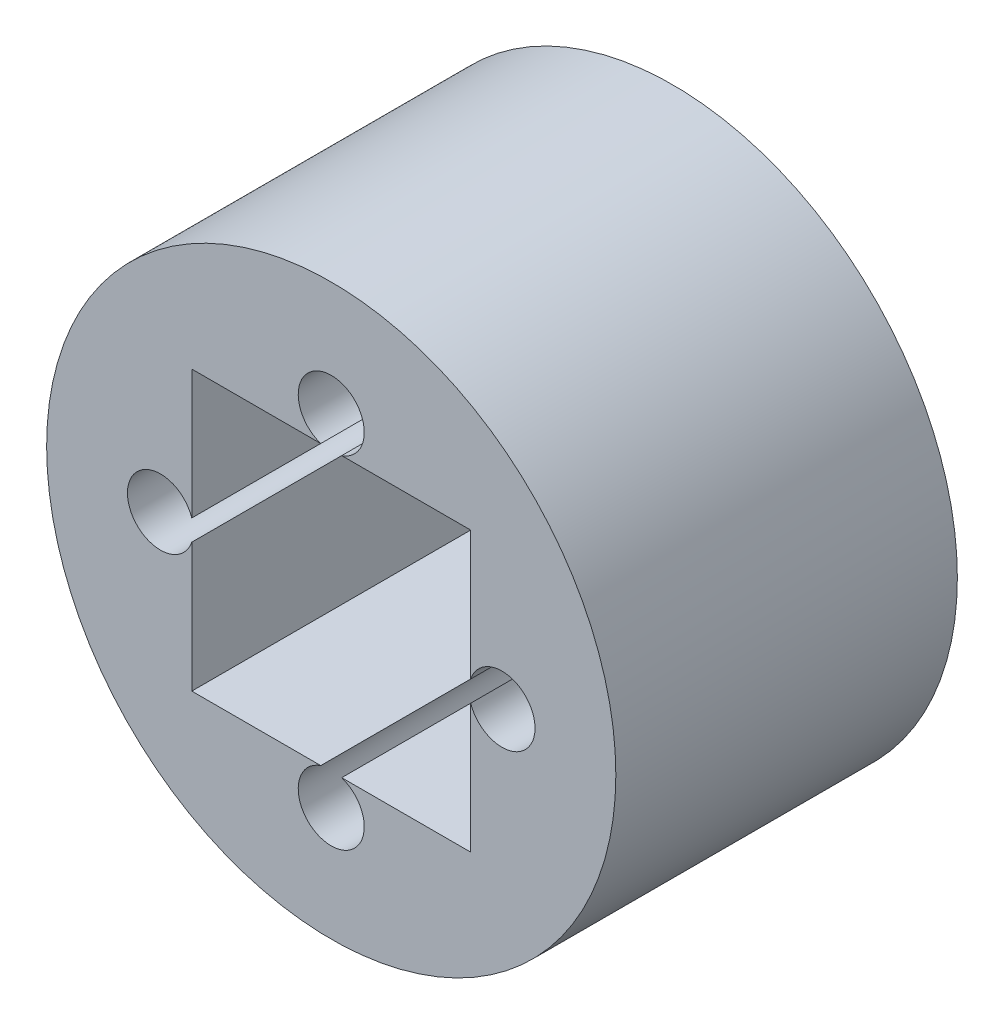
ISO-10303-21;
HEADER;
FILE_DESCRIPTION(('STEP AP214'),'2;1');
FILE_NAME('part.step','',(''),(''),'','','');
FILE_SCHEMA(('AUTOMOTIVE_DESIGN { 1 0 10303 214 1 1 1 1 }'));
ENDSEC;
DATA;
#1=APPLICATION_CONTEXT('core data for automotive mechanical design processes');
#2=APPLICATION_PROTOCOL_DEFINITION('international standard','automotive_design',2000,#1);
#3=PRODUCT_CONTEXT('',#1,'mechanical');
#4=PRODUCT('Part','Part','',(#3));
#5=PRODUCT_RELATED_PRODUCT_CATEGORY('part','',(#4));
#6=PRODUCT_DEFINITION_FORMATION('','',#4);
#7=PRODUCT_DEFINITION_CONTEXT('part definition',#1,'design');
#8=PRODUCT_DEFINITION('design','',#6,#7);
#9=PRODUCT_DEFINITION_SHAPE('','',#8);
#10=(LENGTH_UNIT() NAMED_UNIT(*) SI_UNIT(.MILLI.,.METRE.));
#11=(NAMED_UNIT(*) PLANE_ANGLE_UNIT() SI_UNIT($,.RADIAN.));
#12=(NAMED_UNIT(*) SI_UNIT($,.STERADIAN.) SOLID_ANGLE_UNIT());
#13=UNCERTAINTY_MEASURE_WITH_UNIT(LENGTH_MEASURE(1.E-05),#10,'distance_accuracy_value','');
#14=(GEOMETRIC_REPRESENTATION_CONTEXT(3) GLOBAL_UNCERTAINTY_ASSIGNED_CONTEXT((#13)) GLOBAL_UNIT_ASSIGNED_CONTEXT((#10,
#11,#12)) REPRESENTATION_CONTEXT('',''));
#15=CARTESIAN_POINT('',(0.,0.,0.));
#16=DIRECTION('',(0.,0.,1.));
#17=DIRECTION('',(1.,0.,0.));
#18=AXIS2_PLACEMENT_3D('',#15,#16,#17);
#19=CARTESIAN_POINT('',(6.125,6.125,-7.501));
#20=DIRECTION('',(1.,0.,0.));
#21=DIRECTION('',(0.,1.,0.));
#22=AXIS2_PLACEMENT_3D('',#19,#20,#21);
#23=PLANE('',#22);
#24=DIRECTION('',(0.,-1.,0.));
#25=VECTOR('',#24,1.);
#26=CARTESIAN_POINT('',(6.125,6.125,-7.5));
#27=LINE('',#26,#25);
#28=CARTESIAN_POINT('',(6.125,6.125,-7.5));
#29=VERTEX_POINT('',#28);
#30=CARTESIAN_POINT('',(6.125,0.460298815988065,-7.5));
#31=VERTEX_POINT('',#30);
#32=EDGE_CURVE('E144',#29,#31,#27,.T.);
#33=ORIENTED_EDGE('',*,*,#32,.T.);
#34=DIRECTION('',(0.,0.,1.));
#35=VECTOR('',#34,1.);
#36=CARTESIAN_POINT('',(6.125,0.460298815988067,-7.501));
#37=LINE('',#36,#35);
#38=CARTESIAN_POINT('',(6.125,0.460298815988067,7.5));
#39=VERTEX_POINT('',#38);
#40=EDGE_CURVE('E130',#39,#31,#37,.F.);
#41=ORIENTED_EDGE('',*,*,#40,.F.);
#42=DIRECTION('',(0.,1.,0.));
#43=VECTOR('',#42,1.);
#44=CARTESIAN_POINT('',(6.125,6.125,7.5));
#45=LINE('',#44,#43);
#46=CARTESIAN_POINT('',(6.125,6.125,7.5));
#47=VERTEX_POINT('',#46);
#48=EDGE_CURVE('E141',#39,#47,#45,.T.);
#49=ORIENTED_EDGE('',*,*,#48,.T.);
#50=DIRECTION('',(0.,0.,1.));
#51=VECTOR('',#50,1.);
#52=CARTESIAN_POINT('',(6.125,6.125,-7.501));
#53=LINE('',#52,#51);
#54=EDGE_CURVE('E175',#29,#47,#53,.T.);
#55=ORIENTED_EDGE('',*,*,#54,.F.);
#56=EDGE_LOOP('',(#33,#41,#49,#55));
#57=FACE_BOUND('',#56,.T.);
#58=ADVANCED_FACE('F39',(#57),#23,.F.);
#59=CARTESIAN_POINT('',(-6.125,-6.125,-7.501));
#60=DIRECTION('',(0.,-1.,0.));
#61=DIRECTION('',(0.,0.,-1.));
#62=AXIS2_PLACEMENT_3D('',#59,#60,#61);
#63=PLANE('',#62);
#64=DIRECTION('',(-1.,0.,0.));
#65=VECTOR('',#64,1.);
#66=CARTESIAN_POINT('',(-6.125,-6.125,-7.5));
#67=LINE('',#66,#65);
#68=CARTESIAN_POINT('',(6.125,-6.125,-7.5));
#69=VERTEX_POINT('',#68);
#70=CARTESIAN_POINT('',(0.460298815987988,-6.125,-7.5));
#71=VERTEX_POINT('',#70);
#72=EDGE_CURVE('E255',#69,#71,#67,.T.);
#73=ORIENTED_EDGE('',*,*,#72,.T.);
#74=DIRECTION('',(0.,0.,1.));
#75=VECTOR('',#74,1.);
#76=CARTESIAN_POINT('',(0.460298815987988,-6.125,-7.501));
#77=LINE('',#76,#75);
#78=CARTESIAN_POINT('',(0.460298815987989,-6.125,7.5));
#79=VERTEX_POINT('',#78);
#80=EDGE_CURVE('E222',#79,#71,#77,.F.);
#81=ORIENTED_EDGE('',*,*,#80,.F.);
#82=DIRECTION('',(1.,0.,0.));
#83=VECTOR('',#82,1.);
#84=CARTESIAN_POINT('',(-6.125,-6.125,7.5));
#85=LINE('',#84,#83);
#86=CARTESIAN_POINT('',(6.125,-6.125,7.5));
#87=VERTEX_POINT('',#86);
#88=EDGE_CURVE('E170',#79,#87,#85,.T.);
#89=ORIENTED_EDGE('',*,*,#88,.T.);
#90=DIRECTION('',(0.,0.,1.));
#91=VECTOR('',#90,1.);
#92=CARTESIAN_POINT('',(6.125,-6.125,-7.501));
#93=LINE('',#92,#91);
#94=EDGE_CURVE('E176',#69,#87,#93,.T.);
#95=ORIENTED_EDGE('',*,*,#94,.F.);
#96=EDGE_LOOP('',(#73,#81,#89,#95));
#97=FACE_BOUND('',#96,.T.);
#98=ADVANCED_FACE('F301',(#97),#63,.F.);
#99=CARTESIAN_POINT('',(-6.125,6.125,-7.501));
#100=DIRECTION('',(-1.,0.,0.));
#101=DIRECTION('',(0.,-1.,0.));
#102=AXIS2_PLACEMENT_3D('',#99,#100,#101);
#103=PLANE('',#102);
#104=DIRECTION('',(0.,1.,0.));
#105=VECTOR('',#104,1.);
#106=CARTESIAN_POINT('',(-6.125,6.125,-7.5));
#107=LINE('',#106,#105);
#108=CARTESIAN_POINT('',(-6.125,-6.125,-7.5));
#109=VERTEX_POINT('',#108);
#110=CARTESIAN_POINT('',(-6.125,-0.460298815988067,-7.5));
#111=VERTEX_POINT('',#110);
#112=EDGE_CURVE('E216',#109,#111,#107,.T.);
#113=ORIENTED_EDGE('',*,*,#112,.T.);
#114=DIRECTION('',(0.,0.,1.));
#115=VECTOR('',#114,1.);
#116=CARTESIAN_POINT('',(-6.125,-0.460298815988067,-7.501));
#117=LINE('',#116,#115);
#118=CARTESIAN_POINT('',(-6.125,-0.460298815988068,7.5));
#119=VERTEX_POINT('',#118);
#120=EDGE_CURVE('E234',#119,#111,#117,.F.);
#121=ORIENTED_EDGE('',*,*,#120,.F.);
#122=DIRECTION('',(0.,-1.,0.));
#123=VECTOR('',#122,1.);
#124=CARTESIAN_POINT('',(-6.125,6.125,7.5));
#125=LINE('',#124,#123);
#126=CARTESIAN_POINT('',(-6.125,-6.125,7.5));
#127=VERTEX_POINT('',#126);
#128=EDGE_CURVE('E165',#119,#127,#125,.T.);
#129=ORIENTED_EDGE('',*,*,#128,.T.);
#130=DIRECTION('',(0.,0.,1.));
#131=VECTOR('',#130,1.);
#132=CARTESIAN_POINT('',(-6.125,-6.125,-7.501));
#133=LINE('',#132,#131);
#134=EDGE_CURVE('E181',#109,#127,#133,.T.);
#135=ORIENTED_EDGE('',*,*,#134,.F.);
#136=EDGE_LOOP('',(#113,#121,#129,#135));
#137=FACE_BOUND('',#136,.T.);
#138=ADVANCED_FACE('F270',(#137),#103,.F.);
#139=CARTESIAN_POINT('',(-6.125,6.125,-7.501));
#140=DIRECTION('',(0.,1.,0.));
#141=DIRECTION('',(0.,0.,1.));
#142=AXIS2_PLACEMENT_3D('',#139,#140,#141);
#143=PLANE('',#142);
#144=DIRECTION('',(1.,0.,0.));
#145=VECTOR('',#144,1.);
#146=CARTESIAN_POINT('',(-6.125,6.125,-7.5));
#147=LINE('',#146,#145);
#148=CARTESIAN_POINT('',(-6.125,6.125,-7.5));
#149=VERTEX_POINT('',#148);
#150=CARTESIAN_POINT('',(-0.460298815988069,6.125,-7.5));
#151=VERTEX_POINT('',#150);
#152=EDGE_CURVE('E191',#149,#151,#147,.T.);
#153=ORIENTED_EDGE('',*,*,#152,.T.);
#154=DIRECTION('',(0.,0.,1.));
#155=VECTOR('',#154,1.);
#156=CARTESIAN_POINT('',(-0.460298815988069,6.125,-7.501));
#157=LINE('',#156,#155);
#158=CARTESIAN_POINT('',(-0.460298815988069,6.125,7.5));
#159=VERTEX_POINT('',#158);
#160=EDGE_CURVE('E245',#159,#151,#157,.F.);
#161=ORIENTED_EDGE('',*,*,#160,.F.);
#162=DIRECTION('',(-1.,0.,0.));
#163=VECTOR('',#162,1.);
#164=CARTESIAN_POINT('',(-6.125,6.125,7.5));
#165=LINE('',#164,#163);
#166=CARTESIAN_POINT('',(-6.125,6.125,7.5));
#167=VERTEX_POINT('',#166);
#168=EDGE_CURVE('E158',#159,#167,#165,.T.);
#169=ORIENTED_EDGE('',*,*,#168,.T.);
#170=DIRECTION('',(0.,0.,1.));
#171=VECTOR('',#170,1.);
#172=CARTESIAN_POINT('',(-6.125,6.125,-7.501));
#173=LINE('',#172,#171);
#174=EDGE_CURVE('E185',#149,#167,#173,.T.);
#175=ORIENTED_EDGE('',*,*,#174,.F.);
#176=EDGE_LOOP('',(#153,#161,#169,#175));
#177=FACE_BOUND('',#176,.T.);
#178=ADVANCED_FACE('F287',(#177),#143,.F.);
#179=CARTESIAN_POINT('',(0.,0.,7.5));
#180=DIRECTION('',(0.,0.,-1.));
#181=DIRECTION('',(-1.,0.,0.));
#182=AXIS2_PLACEMENT_3D('',#179,#180,#181);
#183=CYLINDRICAL_SURFACE('',#182,12.5);
#184=CARTESIAN_POINT('',(0.,0.,7.5));
#185=DIRECTION('',(0.,0.,1.));
#186=DIRECTION('',(1.,0.,0.));
#187=AXIS2_PLACEMENT_3D('',#184,#185,#186);
#188=CIRCLE('',#187,12.5);
#189=CARTESIAN_POINT('',(12.5,0.,7.5));
#190=VERTEX_POINT('',#189);
#191=EDGE_CURVE('E11',#190,#190,#188,.T.);
#192=ORIENTED_EDGE('',*,*,#191,.F.);
#193=EDGE_LOOP('',(#192));
#194=FACE_BOUND('',#193,.T.);
#195=CARTESIAN_POINT('',(0.,0.,-7.5));
#196=DIRECTION('',(0.,0.,1.));
#197=DIRECTION('',(1.,0.,0.));
#198=AXIS2_PLACEMENT_3D('',#195,#196,#197);
#199=CIRCLE('',#198,12.5);
#200=CARTESIAN_POINT('',(12.5,0.,-7.5));
#201=VERTEX_POINT('',#200);
#202=EDGE_CURVE('E43',#201,#201,#199,.T.);
#203=ORIENTED_EDGE('',*,*,#202,.T.);
#204=EDGE_LOOP('',(#203));
#205=FACE_BOUND('',#204,.T.);
#206=ADVANCED_FACE('F41',(#194,#205),#183,.T.);
#207=CARTESIAN_POINT('',(0.,0.,7.5));
#208=DIRECTION('',(0.,0.,1.));
#209=DIRECTION('',(1.,0.,0.));
#210=AXIS2_PLACEMENT_3D('',#207,#208,#209);
#211=PLANE('',#210);
#212=CARTESIAN_POINT('',(7.5,0.,7.5));
#213=DIRECTION('',(0.,0.,1.));
#214=DIRECTION('',(1.,0.,0.));
#215=AXIS2_PLACEMENT_3D('',#212,#213,#214);
#216=CIRCLE('',#215,1.45);
#217=CARTESIAN_POINT('',(6.125,-0.460298815988014,7.5));
#218=VERTEX_POINT('',#217);
#219=EDGE_CURVE('E127',#218,#39,#216,.T.);
#220=ORIENTED_EDGE('',*,*,#219,.F.);
#221=EDGE_CURVE('E154',#87,#218,#45,.T.);
#222=ORIENTED_EDGE('',*,*,#221,.F.);
#223=ORIENTED_EDGE('',*,*,#88,.F.);
#224=CARTESIAN_POINT('',(0.,-7.50000000000004,7.5));
#225=DIRECTION('',(0.,0.,1.));
#226=DIRECTION('',(1.,0.,0.));
#227=AXIS2_PLACEMENT_3D('',#224,#225,#226);
#228=CIRCLE('',#227,1.45);
#229=CARTESIAN_POINT('',(-0.460298815987865,-6.125,7.5));
#230=VERTEX_POINT('',#229);
#231=EDGE_CURVE('E226',#230,#79,#228,.T.);
#232=ORIENTED_EDGE('',*,*,#231,.F.);
#233=EDGE_CURVE('E171',#127,#230,#85,.T.);
#234=ORIENTED_EDGE('',*,*,#233,.F.);
#235=ORIENTED_EDGE('',*,*,#128,.F.);
#236=CARTESIAN_POINT('',(-7.5,0.,7.5));
#237=DIRECTION('',(0.,0.,1.));
#238=DIRECTION('',(1.,0.,0.));
#239=AXIS2_PLACEMENT_3D('',#236,#237,#238);
#240=CIRCLE('',#239,1.45);
#241=CARTESIAN_POINT('',(-6.125,0.460298815988013,7.5));
#242=VERTEX_POINT('',#241);
#243=EDGE_CURVE('E238',#242,#119,#240,.T.);
#244=ORIENTED_EDGE('',*,*,#243,.F.);
#245=EDGE_CURVE('E166',#167,#242,#125,.T.);
#246=ORIENTED_EDGE('',*,*,#245,.F.);
#247=ORIENTED_EDGE('',*,*,#168,.F.);
#248=CARTESIAN_POINT('',(0.,7.5,7.5));
#249=DIRECTION('',(0.,0.,1.));
#250=DIRECTION('',(1.,0.,0.));
#251=AXIS2_PLACEMENT_3D('',#248,#249,#250);
#252=CIRCLE('',#251,1.45);
#253=CARTESIAN_POINT('',(0.460298815988014,6.125,7.5));
#254=VERTEX_POINT('',#253);
#255=EDGE_CURVE('E248',#254,#159,#252,.T.);
#256=ORIENTED_EDGE('',*,*,#255,.F.);
#257=EDGE_CURVE('E152',#47,#254,#165,.T.);
#258=ORIENTED_EDGE('',*,*,#257,.F.);
#259=ORIENTED_EDGE('',*,*,#48,.F.);
#260=EDGE_LOOP('',(#220,#222,#223,#232,#234,#235,#244,#246,#247,#256,#258,#259));
#261=FACE_BOUND('',#260,.T.);
#262=ORIENTED_EDGE('',*,*,#191,.T.);
#263=EDGE_LOOP('',(#262));
#264=FACE_BOUND('',#263,.T.);
#265=ADVANCED_FACE('F148',(#261,#264),#211,.T.);
#266=CARTESIAN_POINT('',(0.,0.,-7.5));
#267=DIRECTION('',(0.,0.,1.));
#268=DIRECTION('',(1.,0.,0.));
#269=AXIS2_PLACEMENT_3D('',#266,#267,#268);
#270=PLANE('',#269);
#271=CARTESIAN_POINT('',(6.125,-0.460298815988014,-7.5));
#272=VERTEX_POINT('',#271);
#273=EDGE_CURVE('E159',#272,#69,#27,.T.);
#274=ORIENTED_EDGE('',*,*,#273,.F.);
#275=CARTESIAN_POINT('',(7.5,0.,-7.5));
#276=DIRECTION('',(0.,0.,1.));
#277=DIRECTION('',(1.,0.,0.));
#278=AXIS2_PLACEMENT_3D('',#275,#276,#277);
#279=CIRCLE('',#278,1.45);
#280=EDGE_CURVE('E55',#31,#272,#279,.F.);
#281=ORIENTED_EDGE('',*,*,#280,.F.);
#282=ORIENTED_EDGE('',*,*,#32,.F.);
#283=CARTESIAN_POINT('',(0.460298815988014,6.125,-7.5));
#284=VERTEX_POINT('',#283);
#285=EDGE_CURVE('E180',#284,#29,#147,.T.);
#286=ORIENTED_EDGE('',*,*,#285,.F.);
#287=CARTESIAN_POINT('',(0.,7.5,-7.5));
#288=DIRECTION('',(0.,0.,1.));
#289=DIRECTION('',(1.,0.,0.));
#290=AXIS2_PLACEMENT_3D('',#287,#288,#289);
#291=CIRCLE('',#290,1.45);
#292=EDGE_CURVE('E235',#151,#284,#291,.F.);
#293=ORIENTED_EDGE('',*,*,#292,.F.);
#294=ORIENTED_EDGE('',*,*,#152,.F.);
#295=CARTESIAN_POINT('',(-6.125,0.460298815988013,-7.5));
#296=VERTEX_POINT('',#295);
#297=EDGE_CURVE('E213',#296,#149,#107,.T.);
#298=ORIENTED_EDGE('',*,*,#297,.F.);
#299=CARTESIAN_POINT('',(-7.5,0.,-7.5));
#300=DIRECTION('',(0.,0.,1.));
#301=DIRECTION('',(1.,0.,0.));
#302=AXIS2_PLACEMENT_3D('',#299,#300,#301);
#303=CIRCLE('',#302,1.45);
#304=EDGE_CURVE('E223',#111,#296,#303,.F.);
#305=ORIENTED_EDGE('',*,*,#304,.F.);
#306=ORIENTED_EDGE('',*,*,#112,.F.);
#307=CARTESIAN_POINT('',(-0.460298815987865,-6.125,-7.5));
#308=VERTEX_POINT('',#307);
#309=EDGE_CURVE('E254',#308,#109,#67,.T.);
#310=ORIENTED_EDGE('',*,*,#309,.F.);
#311=CARTESIAN_POINT('',(0.,-7.50000000000004,-7.5));
#312=DIRECTION('',(0.,0.,1.));
#313=DIRECTION('',(1.,0.,0.));
#314=AXIS2_PLACEMENT_3D('',#311,#312,#313);
#315=CIRCLE('',#314,1.45);
#316=EDGE_CURVE('E63',#71,#308,#315,.F.);
#317=ORIENTED_EDGE('',*,*,#316,.F.);
#318=ORIENTED_EDGE('',*,*,#72,.F.);
#319=EDGE_LOOP('',(#274,#281,#282,#286,#293,#294,#298,#305,#306,#310,#317,#318));
#320=FACE_BOUND('',#319,.T.);
#321=ORIENTED_EDGE('',*,*,#202,.F.);
#322=EDGE_LOOP('',(#321));
#323=FACE_BOUND('',#322,.T.);
#324=ADVANCED_FACE('F209',(#320,#323),#270,.F.);
#325=ORIENTED_EDGE('',*,*,#221,.T.);
#326=DIRECTION('',(0.,0.,1.));
#327=VECTOR('',#326,1.);
#328=CARTESIAN_POINT('',(6.125,-0.460298815988014,-7.501));
#329=LINE('',#328,#327);
#330=EDGE_CURVE('E131',#272,#218,#329,.T.);
#331=ORIENTED_EDGE('',*,*,#330,.F.);
#332=ORIENTED_EDGE('',*,*,#273,.T.);
#333=ORIENTED_EDGE('',*,*,#94,.T.);
#334=EDGE_LOOP('',(#325,#331,#332,#333));
#335=FACE_BOUND('',#334,.T.);
#336=ADVANCED_FACE('F303',(#335),#23,.F.);
#337=ORIENTED_EDGE('',*,*,#233,.T.);
#338=DIRECTION('',(0.,0.,1.));
#339=VECTOR('',#338,1.);
#340=CARTESIAN_POINT('',(-0.460298815987865,-6.125,-7.501));
#341=LINE('',#340,#339);
#342=EDGE_CURVE('E219',#308,#230,#341,.T.);
#343=ORIENTED_EDGE('',*,*,#342,.F.);
#344=ORIENTED_EDGE('',*,*,#309,.T.);
#345=ORIENTED_EDGE('',*,*,#134,.T.);
#346=EDGE_LOOP('',(#337,#343,#344,#345));
#347=FACE_BOUND('',#346,.T.);
#348=ADVANCED_FACE('F266',(#347),#63,.F.);
#349=ORIENTED_EDGE('',*,*,#245,.T.);
#350=DIRECTION('',(0.,0.,1.));
#351=VECTOR('',#350,1.);
#352=CARTESIAN_POINT('',(-6.125,0.460298815988013,-7.501));
#353=LINE('',#352,#351);
#354=EDGE_CURVE('E231',#296,#242,#353,.T.);
#355=ORIENTED_EDGE('',*,*,#354,.F.);
#356=ORIENTED_EDGE('',*,*,#297,.T.);
#357=ORIENTED_EDGE('',*,*,#174,.T.);
#358=EDGE_LOOP('',(#349,#355,#356,#357));
#359=FACE_BOUND('',#358,.T.);
#360=ADVANCED_FACE('F280',(#359),#103,.F.);
#361=ORIENTED_EDGE('',*,*,#257,.T.);
#362=DIRECTION('',(0.,0.,1.));
#363=VECTOR('',#362,1.);
#364=CARTESIAN_POINT('',(0.460298815988014,6.125,-7.501));
#365=LINE('',#364,#363);
#366=EDGE_CURVE('E205',#284,#254,#365,.T.);
#367=ORIENTED_EDGE('',*,*,#366,.F.);
#368=ORIENTED_EDGE('',*,*,#285,.T.);
#369=ORIENTED_EDGE('',*,*,#54,.T.);
#370=EDGE_LOOP('',(#361,#367,#368,#369));
#371=FACE_BOUND('',#370,.T.);
#372=ADVANCED_FACE('F204',(#371),#143,.F.);
#373=CARTESIAN_POINT('',(0.,7.5,-7.501));
#374=DIRECTION('',(0.,0.,1.));
#375=DIRECTION('',(1.,0.,0.));
#376=AXIS2_PLACEMENT_3D('',#373,#374,#375);
#377=CYLINDRICAL_SURFACE('',#376,1.45);
#378=ORIENTED_EDGE('',*,*,#160,.T.);
#379=ORIENTED_EDGE('',*,*,#292,.T.);
#380=ORIENTED_EDGE('',*,*,#366,.T.);
#381=ORIENTED_EDGE('',*,*,#255,.T.);
#382=EDGE_LOOP('',(#378,#379,#380,#381));
#383=FACE_BOUND('',#382,.T.);
#384=ADVANCED_FACE('F289',(#383),#377,.F.);
#385=CARTESIAN_POINT('',(-7.5,0.,-7.501));
#386=DIRECTION('',(0.,0.,1.));
#387=DIRECTION('',(1.,0.,0.));
#388=AXIS2_PLACEMENT_3D('',#385,#386,#387);
#389=CYLINDRICAL_SURFACE('',#388,1.45);
#390=ORIENTED_EDGE('',*,*,#120,.T.);
#391=ORIENTED_EDGE('',*,*,#304,.T.);
#392=ORIENTED_EDGE('',*,*,#354,.T.);
#393=ORIENTED_EDGE('',*,*,#243,.T.);
#394=EDGE_LOOP('',(#390,#391,#392,#393));
#395=FACE_BOUND('',#394,.T.);
#396=ADVANCED_FACE('F277',(#395),#389,.F.);
#397=CARTESIAN_POINT('',(0.,-7.50000000000004,-7.501));
#398=DIRECTION('',(0.,0.,1.));
#399=DIRECTION('',(1.,0.,0.));
#400=AXIS2_PLACEMENT_3D('',#397,#398,#399);
#401=CYLINDRICAL_SURFACE('',#400,1.45);
#402=ORIENTED_EDGE('',*,*,#80,.T.);
#403=ORIENTED_EDGE('',*,*,#316,.T.);
#404=ORIENTED_EDGE('',*,*,#342,.T.);
#405=ORIENTED_EDGE('',*,*,#231,.T.);
#406=EDGE_LOOP('',(#402,#403,#404,#405));
#407=FACE_BOUND('',#406,.T.);
#408=ADVANCED_FACE('F296',(#407),#401,.F.);
#409=CARTESIAN_POINT('',(7.5,0.,-7.501));
#410=DIRECTION('',(0.,0.,1.));
#411=DIRECTION('',(1.,0.,0.));
#412=AXIS2_PLACEMENT_3D('',#409,#410,#411);
#413=CYLINDRICAL_SURFACE('',#412,1.45);
#414=ORIENTED_EDGE('',*,*,#40,.T.);
#415=ORIENTED_EDGE('',*,*,#280,.T.);
#416=ORIENTED_EDGE('',*,*,#330,.T.);
#417=ORIENTED_EDGE('',*,*,#219,.T.);
#418=EDGE_LOOP('',(#414,#415,#416,#417));
#419=FACE_BOUND('',#418,.T.);
#420=ADVANCED_FACE('F129',(#419),#413,.F.);
#421=CLOSED_SHELL('',(#58,#98,#138,#178,#206,#265,#324,#336,#348,#360,#372,#384,#396,#408,#420));
#422=MANIFOLD_SOLID_BREP('B2',#421);
#423=ADVANCED_BREP_SHAPE_REPRESENTATION('',(#18,#422),#14);
#424=SHAPE_DEFINITION_REPRESENTATION(#9,#423);
ENDSEC;
END-ISO-10303-21;
